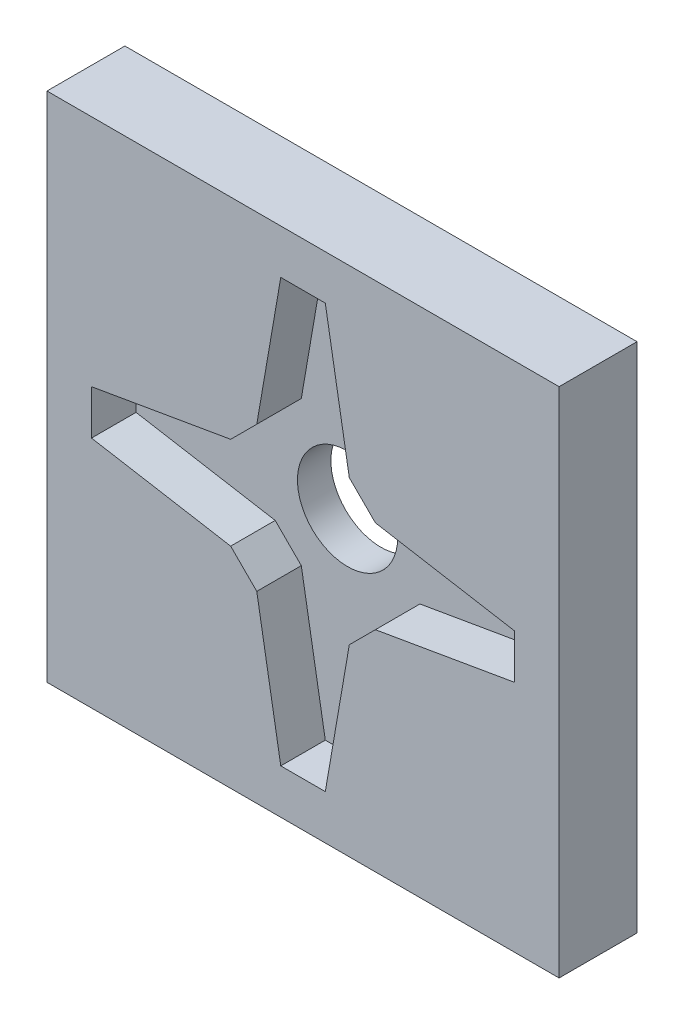
ISO-10303-21;
HEADER;
FILE_DESCRIPTION(('STEP AP214'),'2;1');
FILE_NAME('part.step','',(''),(''),'','','');
FILE_SCHEMA(('AUTOMOTIVE_DESIGN { 1 0 10303 214 1 1 1 1 }'));
ENDSEC;
DATA;
#1=APPLICATION_CONTEXT('core data for automotive mechanical design processes');
#2=APPLICATION_PROTOCOL_DEFINITION('international standard','automotive_design',2000,#1);
#3=PRODUCT_CONTEXT('',#1,'mechanical');
#4=PRODUCT('Part','Part','',(#3));
#5=PRODUCT_RELATED_PRODUCT_CATEGORY('part','',(#4));
#6=PRODUCT_DEFINITION_FORMATION('','',#4);
#7=PRODUCT_DEFINITION_CONTEXT('part definition',#1,'design');
#8=PRODUCT_DEFINITION('design','',#6,#7);
#9=PRODUCT_DEFINITION_SHAPE('','',#8);
#10=(LENGTH_UNIT() NAMED_UNIT(*) SI_UNIT(.MILLI.,.METRE.));
#11=(NAMED_UNIT(*) PLANE_ANGLE_UNIT() SI_UNIT($,.RADIAN.));
#12=(NAMED_UNIT(*) SI_UNIT($,.STERADIAN.) SOLID_ANGLE_UNIT());
#13=UNCERTAINTY_MEASURE_WITH_UNIT(LENGTH_MEASURE(1.E-05),#10,'distance_accuracy_value','');
#14=(GEOMETRIC_REPRESENTATION_CONTEXT(3) GLOBAL_UNCERTAINTY_ASSIGNED_CONTEXT((#13)) GLOBAL_UNIT_ASSIGNED_CONTEXT((#10,
#11,#12)) REPRESENTATION_CONTEXT('',''));
#15=CARTESIAN_POINT('',(0.,0.,0.));
#16=DIRECTION('',(0.,0.,1.));
#17=DIRECTION('',(1.,0.,0.));
#18=AXIS2_PLACEMENT_3D('',#15,#16,#17);
#19=CARTESIAN_POINT('',(0.,0.,7.));
#20=DIRECTION('',(0.,0.,1.));
#21=DIRECTION('',(1.,0.,0.));
#22=AXIS2_PLACEMENT_3D('',#19,#20,#21);
#23=PLANE('',#22);
#24=DIRECTION('',(-0.707106781186547,0.707106781186548,0.));
#25=VECTOR('',#24,1.);
#26=CARTESIAN_POINT('',(4.1551724137931,6.5,7.));
#27=LINE('',#26,#25);
#28=CARTESIAN_POINT('',(6.5,4.1551724137931,7.));
#29=VERTEX_POINT('',#28);
#30=CARTESIAN_POINT('',(4.1551724137931,6.5,7.));
#31=VERTEX_POINT('',#30);
#32=EDGE_CURVE('E185',#29,#31,#27,.T.);
#33=ORIENTED_EDGE('',*,*,#32,.F.);
#34=DIRECTION('',(-0.985460115744348,0.169906916507646,0.));
#35=VECTOR('',#34,1.);
#36=CARTESIAN_POINT('',(4.5,4.5,7.));
#37=LINE('',#36,#35);
#38=CARTESIAN_POINT('',(19.,2.,7.));
#39=VERTEX_POINT('',#38);
#40=EDGE_CURVE('E252',#39,#29,#37,.T.);
#41=ORIENTED_EDGE('',*,*,#40,.F.);
#42=DIRECTION('',(0.,1.,0.));
#43=VECTOR('',#42,1.);
#44=CARTESIAN_POINT('',(19.,2.,7.));
#45=LINE('',#44,#43);
#46=CARTESIAN_POINT('',(19.,-2.,7.));
#47=VERTEX_POINT('',#46);
#48=EDGE_CURVE('E248',#47,#39,#45,.T.);
#49=ORIENTED_EDGE('',*,*,#48,.F.);
#50=DIRECTION('',(0.985460115744348,0.169906916507646,0.));
#51=VECTOR('',#50,1.);
#52=CARTESIAN_POINT('',(4.5,-4.5,7.));
#53=LINE('',#52,#51);
#54=CARTESIAN_POINT('',(6.5,-4.1551724137931,7.));
#55=VERTEX_POINT('',#54);
#56=EDGE_CURVE('E245',#55,#47,#53,.T.);
#57=ORIENTED_EDGE('',*,*,#56,.F.);
#58=DIRECTION('',(0.707106781186547,0.707106781186548,0.));
#59=VECTOR('',#58,1.);
#60=CARTESIAN_POINT('',(4.1551724137931,-6.5,7.));
#61=LINE('',#60,#59);
#62=CARTESIAN_POINT('',(4.1551724137931,-6.5,7.));
#63=VERTEX_POINT('',#62);
#64=EDGE_CURVE('E553',#63,#55,#61,.T.);
#65=ORIENTED_EDGE('',*,*,#64,.F.);
#66=DIRECTION('',(0.169906916507646,0.985460115744348,0.));
#67=VECTOR('',#66,1.);
#68=CARTESIAN_POINT('',(2.,-19.,7.));
#69=LINE('',#68,#67);
#70=CARTESIAN_POINT('',(2.,-19.,7.));
#71=VERTEX_POINT('',#70);
#72=EDGE_CURVE('E241',#71,#63,#69,.T.);
#73=ORIENTED_EDGE('',*,*,#72,.F.);
#74=DIRECTION('',(1.,0.,0.));
#75=VECTOR('',#74,1.);
#76=CARTESIAN_POINT('',(-2.,-19.,7.));
#77=LINE('',#76,#75);
#78=CARTESIAN_POINT('',(-2.,-19.,7.));
#79=VERTEX_POINT('',#78);
#80=EDGE_CURVE('E238',#79,#71,#77,.T.);
#81=ORIENTED_EDGE('',*,*,#80,.F.);
#82=DIRECTION('',(0.169906916507646,-0.985460115744348,0.));
#83=VECTOR('',#82,1.);
#84=CARTESIAN_POINT('',(-2.,-19.,7.));
#85=LINE('',#84,#83);
#86=CARTESIAN_POINT('',(-4.1551724137931,-6.5,7.));
#87=VERTEX_POINT('',#86);
#88=EDGE_CURVE('E235',#87,#79,#85,.T.);
#89=ORIENTED_EDGE('',*,*,#88,.F.);
#90=DIRECTION('',(0.707106781186547,-0.707106781186548,0.));
#91=VECTOR('',#90,1.);
#92=CARTESIAN_POINT('',(-4.1551724137931,-6.5,7.));
#93=LINE('',#92,#91);
#94=CARTESIAN_POINT('',(-6.5,-4.1551724137931,7.));
#95=VERTEX_POINT('',#94);
#96=EDGE_CURVE('E550',#95,#87,#93,.T.);
#97=ORIENTED_EDGE('',*,*,#96,.F.);
#98=DIRECTION('',(0.985460115744348,-0.169906916507646,0.));
#99=VECTOR('',#98,1.);
#100=CARTESIAN_POINT('',(-4.5,-4.5,7.));
#101=LINE('',#100,#99);
#102=CARTESIAN_POINT('',(-19.,-2.,7.));
#103=VERTEX_POINT('',#102);
#104=EDGE_CURVE('E231',#103,#95,#101,.T.);
#105=ORIENTED_EDGE('',*,*,#104,.F.);
#106=DIRECTION('',(0.,-1.,0.));
#107=VECTOR('',#106,1.);
#108=CARTESIAN_POINT('',(-19.,2.,7.));
#109=LINE('',#108,#107);
#110=CARTESIAN_POINT('',(-19.,2.,7.));
#111=VERTEX_POINT('',#110);
#112=EDGE_CURVE('E228',#111,#103,#109,.T.);
#113=ORIENTED_EDGE('',*,*,#112,.F.);
#114=DIRECTION('',(-0.985460115744348,-0.169906916507646,0.));
#115=VECTOR('',#114,1.);
#116=CARTESIAN_POINT('',(-4.5,4.5,7.));
#117=LINE('',#116,#115);
#118=CARTESIAN_POINT('',(-6.5,4.1551724137931,7.));
#119=VERTEX_POINT('',#118);
#120=EDGE_CURVE('E225',#119,#111,#117,.T.);
#121=ORIENTED_EDGE('',*,*,#120,.F.);
#122=DIRECTION('',(-0.707106781186547,-0.707106781186548,0.));
#123=VECTOR('',#122,1.);
#124=CARTESIAN_POINT('',(-4.1551724137931,6.5,7.));
#125=LINE('',#124,#123);
#126=CARTESIAN_POINT('',(-4.1551724137931,6.5,7.));
#127=VERTEX_POINT('',#126);
#128=EDGE_CURVE('E547',#127,#119,#125,.T.);
#129=ORIENTED_EDGE('',*,*,#128,.F.);
#130=DIRECTION('',(-0.169906916507646,-0.985460115744348,0.));
#131=VECTOR('',#130,1.);
#132=CARTESIAN_POINT('',(-2.,19.,7.));
#133=LINE('',#132,#131);
#134=CARTESIAN_POINT('',(-2.,19.,7.));
#135=VERTEX_POINT('',#134);
#136=EDGE_CURVE('E194',#135,#127,#133,.T.);
#137=ORIENTED_EDGE('',*,*,#136,.F.);
#138=DIRECTION('',(-1.,0.,0.));
#139=VECTOR('',#138,1.);
#140=CARTESIAN_POINT('',(-2.,19.,7.));
#141=LINE('',#140,#139);
#142=CARTESIAN_POINT('',(2.,19.,7.));
#143=VERTEX_POINT('',#142);
#144=EDGE_CURVE('E220',#143,#135,#141,.T.);
#145=ORIENTED_EDGE('',*,*,#144,.F.);
#146=DIRECTION('',(-0.169906916507646,0.985460115744348,0.));
#147=VECTOR('',#146,1.);
#148=CARTESIAN_POINT('',(2.,19.,7.));
#149=LINE('',#148,#147);
#150=EDGE_CURVE('E217',#31,#143,#149,.T.);
#151=ORIENTED_EDGE('',*,*,#150,.F.);
#152=EDGE_LOOP('',(#33,#41,#49,#57,#65,#73,#81,#89,#97,#105,#113,#121,#129,#137,#145,#151));
#153=FACE_BOUND('',#152,.T.);
#154=DIRECTION('',(0.,-1.,0.));
#155=VECTOR('',#154,1.);
#156=CARTESIAN_POINT('',(-23.,-23.,7.));
#157=LINE('',#156,#155);
#158=CARTESIAN_POINT('',(-23.,23.,7.));
#159=VERTEX_POINT('',#158);
#160=CARTESIAN_POINT('',(-23.,-23.,7.));
#161=VERTEX_POINT('',#160);
#162=EDGE_CURVE('E288',#159,#161,#157,.T.);
#163=ORIENTED_EDGE('',*,*,#162,.T.);
#164=DIRECTION('',(1.,0.,0.));
#165=VECTOR('',#164,1.);
#166=CARTESIAN_POINT('',(23.,-23.,7.));
#167=LINE('',#166,#165);
#168=CARTESIAN_POINT('',(23.,-23.,7.));
#169=VERTEX_POINT('',#168);
#170=EDGE_CURVE('E292',#161,#169,#167,.T.);
#171=ORIENTED_EDGE('',*,*,#170,.T.);
#172=DIRECTION('',(0.,1.,0.));
#173=VECTOR('',#172,1.);
#174=CARTESIAN_POINT('',(23.,-23.,7.));
#175=LINE('',#174,#173);
#176=CARTESIAN_POINT('',(23.,23.,7.));
#177=VERTEX_POINT('',#176);
#178=EDGE_CURVE('E296',#169,#177,#175,.T.);
#179=ORIENTED_EDGE('',*,*,#178,.T.);
#180=DIRECTION('',(-1.,0.,0.));
#181=VECTOR('',#180,1.);
#182=CARTESIAN_POINT('',(23.,23.,7.));
#183=LINE('',#182,#181);
#184=EDGE_CURVE('E299',#177,#159,#183,.T.);
#185=ORIENTED_EDGE('',*,*,#184,.T.);
#186=EDGE_LOOP('',(#163,#171,#179,#185));
#187=FACE_BOUND('',#186,.T.);
#188=ADVANCED_FACE('F39',(#153,#187),#23,.T.);
#189=CARTESIAN_POINT('',(0.,0.,0.));
#190=DIRECTION('',(0.,0.,1.));
#191=DIRECTION('',(1.,0.,0.));
#192=AXIS2_PLACEMENT_3D('',#189,#190,#191);
#193=PLANE('',#192);
#194=CARTESIAN_POINT('',(0.,0.,0.));
#195=DIRECTION('',(0.,0.,1.));
#196=DIRECTION('',(1.,0.,0.));
#197=AXIS2_PLACEMENT_3D('',#194,#195,#196);
#198=CIRCLE('',#197,4.5);
#199=CARTESIAN_POINT('',(4.5,0.,0.));
#200=VERTEX_POINT('',#199);
#201=EDGE_CURVE('E564',#200,#200,#198,.T.);
#202=ORIENTED_EDGE('',*,*,#201,.T.);
#203=EDGE_LOOP('',(#202));
#204=FACE_BOUND('',#203,.T.);
#205=DIRECTION('',(0.,-1.,0.));
#206=VECTOR('',#205,1.);
#207=CARTESIAN_POINT('',(-23.,-23.,0.));
#208=LINE('',#207,#206);
#209=CARTESIAN_POINT('',(-23.,23.,0.));
#210=VERTEX_POINT('',#209);
#211=CARTESIAN_POINT('',(-23.,-23.,0.));
#212=VERTEX_POINT('',#211);
#213=EDGE_CURVE('E287',#210,#212,#208,.T.);
#214=ORIENTED_EDGE('',*,*,#213,.F.);
#215=DIRECTION('',(-1.,0.,0.));
#216=VECTOR('',#215,1.);
#217=CARTESIAN_POINT('',(23.,23.,0.));
#218=LINE('',#217,#216);
#219=CARTESIAN_POINT('',(23.,23.,0.));
#220=VERTEX_POINT('',#219);
#221=EDGE_CURVE('E293',#220,#210,#218,.T.);
#222=ORIENTED_EDGE('',*,*,#221,.F.);
#223=DIRECTION('',(0.,1.,0.));
#224=VECTOR('',#223,1.);
#225=CARTESIAN_POINT('',(23.,-23.,0.));
#226=LINE('',#225,#224);
#227=CARTESIAN_POINT('',(23.,-23.,0.));
#228=VERTEX_POINT('',#227);
#229=EDGE_CURVE('E310',#228,#220,#226,.T.);
#230=ORIENTED_EDGE('',*,*,#229,.F.);
#231=DIRECTION('',(1.,0.,0.));
#232=VECTOR('',#231,1.);
#233=CARTESIAN_POINT('',(23.,-23.,0.));
#234=LINE('',#233,#232);
#235=EDGE_CURVE('E306',#212,#228,#234,.T.);
#236=ORIENTED_EDGE('',*,*,#235,.F.);
#237=EDGE_LOOP('',(#214,#222,#230,#236));
#238=FACE_BOUND('',#237,.T.);
#239=ADVANCED_FACE('F335',(#204,#238),#193,.F.);
#240=CARTESIAN_POINT('',(-23.,-23.,7.));
#241=DIRECTION('',(1.,0.,0.));
#242=DIRECTION('',(0.,0.,-1.));
#243=AXIS2_PLACEMENT_3D('',#240,#241,#242);
#244=PLANE('',#243);
#245=DIRECTION('',(0.,0.,-1.));
#246=VECTOR('',#245,1.);
#247=CARTESIAN_POINT('',(-23.,23.,7.));
#248=LINE('',#247,#246);
#249=EDGE_CURVE('E302',#159,#210,#248,.T.);
#250=ORIENTED_EDGE('',*,*,#249,.T.);
#251=ORIENTED_EDGE('',*,*,#213,.T.);
#252=DIRECTION('',(0.,0.,-1.));
#253=VECTOR('',#252,1.);
#254=CARTESIAN_POINT('',(-23.,-23.,7.));
#255=LINE('',#254,#253);
#256=EDGE_CURVE('E48',#161,#212,#255,.T.);
#257=ORIENTED_EDGE('',*,*,#256,.F.);
#258=ORIENTED_EDGE('',*,*,#162,.F.);
#259=EDGE_LOOP('',(#250,#251,#257,#258));
#260=FACE_BOUND('',#259,.T.);
#261=ADVANCED_FACE('F41',(#260),#244,.F.);
#262=CARTESIAN_POINT('',(23.,-23.,7.));
#263=DIRECTION('',(0.,1.,0.));
#264=DIRECTION('',(0.,0.,1.));
#265=AXIS2_PLACEMENT_3D('',#262,#263,#264);
#266=PLANE('',#265);
#267=ORIENTED_EDGE('',*,*,#256,.T.);
#268=ORIENTED_EDGE('',*,*,#235,.T.);
#269=DIRECTION('',(0.,0.,-1.));
#270=VECTOR('',#269,1.);
#271=CARTESIAN_POINT('',(23.,-23.,7.));
#272=LINE('',#271,#270);
#273=EDGE_CURVE('E322',#169,#228,#272,.T.);
#274=ORIENTED_EDGE('',*,*,#273,.F.);
#275=ORIENTED_EDGE('',*,*,#170,.F.);
#276=EDGE_LOOP('',(#267,#268,#274,#275));
#277=FACE_BOUND('',#276,.T.);
#278=ADVANCED_FACE('F328',(#277),#266,.F.);
#279=CARTESIAN_POINT('',(23.,-23.,7.));
#280=DIRECTION('',(-1.,0.,0.));
#281=DIRECTION('',(0.,0.,1.));
#282=AXIS2_PLACEMENT_3D('',#279,#280,#281);
#283=PLANE('',#282);
#284=ORIENTED_EDGE('',*,*,#273,.T.);
#285=ORIENTED_EDGE('',*,*,#229,.T.);
#286=DIRECTION('',(0.,0.,-1.));
#287=VECTOR('',#286,1.);
#288=CARTESIAN_POINT('',(23.,23.,7.));
#289=LINE('',#288,#287);
#290=EDGE_CURVE('E319',#177,#220,#289,.T.);
#291=ORIENTED_EDGE('',*,*,#290,.F.);
#292=ORIENTED_EDGE('',*,*,#178,.F.);
#293=EDGE_LOOP('',(#284,#285,#291,#292));
#294=FACE_BOUND('',#293,.T.);
#295=ADVANCED_FACE('F344',(#294),#283,.F.);
#296=CARTESIAN_POINT('',(23.,23.,7.));
#297=DIRECTION('',(0.,-1.,0.));
#298=DIRECTION('',(0.,0.,-1.));
#299=AXIS2_PLACEMENT_3D('',#296,#297,#298);
#300=PLANE('',#299);
#301=ORIENTED_EDGE('',*,*,#290,.T.);
#302=ORIENTED_EDGE('',*,*,#221,.T.);
#303=ORIENTED_EDGE('',*,*,#249,.F.);
#304=ORIENTED_EDGE('',*,*,#184,.F.);
#305=EDGE_LOOP('',(#301,#302,#303,#304));
#306=FACE_BOUND('',#305,.T.);
#307=ADVANCED_FACE('F340',(#306),#300,.F.);
#308=CARTESIAN_POINT('',(2.,19.,7.));
#309=DIRECTION('',(-0.985460115744348,-0.169906916507646,0.));
#310=DIRECTION('',(0.169906916507646,-0.985460115744348,0.));
#311=AXIS2_PLACEMENT_3D('',#308,#309,#310);
#312=PLANE('',#311);
#313=DIRECTION('',(0.,0.,1.));
#314=VECTOR('',#313,1.);
#315=CARTESIAN_POINT('',(4.1551724137931,6.5,3.));
#316=LINE('',#315,#314);
#317=CARTESIAN_POINT('',(4.1551724137931,6.5,3.));
#318=VERTEX_POINT('',#317);
#319=EDGE_CURVE('E544',#318,#31,#316,.T.);
#320=ORIENTED_EDGE('',*,*,#319,.T.);
#321=ORIENTED_EDGE('',*,*,#150,.T.);
#322=DIRECTION('',(0.,0.,-1.));
#323=VECTOR('',#322,1.);
#324=CARTESIAN_POINT('',(2.,19.,7.));
#325=LINE('',#324,#323);
#326=CARTESIAN_POINT('',(2.,19.,3.));
#327=VERTEX_POINT('',#326);
#328=EDGE_CURVE('E283',#143,#327,#325,.T.);
#329=ORIENTED_EDGE('',*,*,#328,.T.);
#330=DIRECTION('',(-0.169906916507646,0.985460115744348,0.));
#331=VECTOR('',#330,1.);
#332=CARTESIAN_POINT('',(2.,19.,3.));
#333=LINE('',#332,#331);
#334=EDGE_CURVE('E209',#318,#327,#333,.T.);
#335=ORIENTED_EDGE('',*,*,#334,.F.);
#336=EDGE_LOOP('',(#320,#321,#329,#335));
#337=FACE_BOUND('',#336,.T.);
#338=ADVANCED_FACE('F356',(#337),#312,.T.);
#339=CARTESIAN_POINT('',(-2.,19.,7.));
#340=DIRECTION('',(0.,-1.,0.));
#341=DIRECTION('',(0.,0.,-1.));
#342=AXIS2_PLACEMENT_3D('',#339,#340,#341);
#343=PLANE('',#342);
#344=DIRECTION('',(-1.,0.,0.));
#345=VECTOR('',#344,1.);
#346=CARTESIAN_POINT('',(-2.,19.,3.));
#347=LINE('',#346,#345);
#348=CARTESIAN_POINT('',(-2.,19.,3.));
#349=VERTEX_POINT('',#348);
#350=EDGE_CURVE('E203',#327,#349,#347,.T.);
#351=ORIENTED_EDGE('',*,*,#350,.F.);
#352=ORIENTED_EDGE('',*,*,#328,.F.);
#353=ORIENTED_EDGE('',*,*,#144,.T.);
#354=DIRECTION('',(0.,0.,-1.));
#355=VECTOR('',#354,1.);
#356=CARTESIAN_POINT('',(-2.,19.,7.));
#357=LINE('',#356,#355);
#358=EDGE_CURVE('E280',#135,#349,#357,.T.);
#359=ORIENTED_EDGE('',*,*,#358,.T.);
#360=EDGE_LOOP('',(#351,#352,#353,#359));
#361=FACE_BOUND('',#360,.T.);
#362=ADVANCED_FACE('F408',(#361),#343,.T.);
#363=CARTESIAN_POINT('',(-2.,19.,7.));
#364=DIRECTION('',(0.985460115744348,-0.169906916507646,0.));
#365=DIRECTION('',(0.169906916507646,0.985460115744348,0.));
#366=AXIS2_PLACEMENT_3D('',#363,#364,#365);
#367=PLANE('',#366);
#368=DIRECTION('',(0.,0.,1.));
#369=VECTOR('',#368,1.);
#370=CARTESIAN_POINT('',(-4.1551724137931,6.5,3.));
#371=LINE('',#370,#369);
#372=CARTESIAN_POINT('',(-4.1551724137931,6.5,3.));
#373=VERTEX_POINT('',#372);
#374=EDGE_CURVE('E178',#373,#127,#371,.T.);
#375=ORIENTED_EDGE('',*,*,#374,.F.);
#376=DIRECTION('',(-0.169906916507646,-0.985460115744348,0.));
#377=VECTOR('',#376,1.);
#378=CARTESIAN_POINT('',(-2.,19.,3.));
#379=LINE('',#378,#377);
#380=EDGE_CURVE('E191',#349,#373,#379,.T.);
#381=ORIENTED_EDGE('',*,*,#380,.F.);
#382=ORIENTED_EDGE('',*,*,#358,.F.);
#383=ORIENTED_EDGE('',*,*,#136,.T.);
#384=EDGE_LOOP('',(#375,#381,#382,#383));
#385=FACE_BOUND('',#384,.T.);
#386=ADVANCED_FACE('F189',(#385),#367,.T.);
#387=CARTESIAN_POINT('',(-4.5,4.5,7.));
#388=DIRECTION('',(0.169906916507646,-0.985460115744348,0.));
#389=DIRECTION('',(0.985460115744348,0.169906916507646,0.));
#390=AXIS2_PLACEMENT_3D('',#387,#388,#389);
#391=PLANE('',#390);
#392=DIRECTION('',(0.,0.,1.));
#393=VECTOR('',#392,1.);
#394=CARTESIAN_POINT('',(-6.5,4.1551724137931,3.));
#395=LINE('',#394,#393);
#396=CARTESIAN_POINT('',(-6.5,4.1551724137931,3.));
#397=VERTEX_POINT('',#396);
#398=EDGE_CURVE('E181',#397,#119,#395,.T.);
#399=ORIENTED_EDGE('',*,*,#398,.T.);
#400=ORIENTED_EDGE('',*,*,#120,.T.);
#401=DIRECTION('',(0.,0.,-1.));
#402=VECTOR('',#401,1.);
#403=CARTESIAN_POINT('',(-19.,2.,7.));
#404=LINE('',#403,#402);
#405=CARTESIAN_POINT('',(-19.,2.,3.));
#406=VERTEX_POINT('',#405);
#407=EDGE_CURVE('E276',#111,#406,#404,.T.);
#408=ORIENTED_EDGE('',*,*,#407,.T.);
#409=DIRECTION('',(-0.985460115744348,-0.169906916507646,0.));
#410=VECTOR('',#409,1.);
#411=CARTESIAN_POINT('',(-4.5,4.5,3.));
#412=LINE('',#411,#410);
#413=EDGE_CURVE('E205',#397,#406,#412,.T.);
#414=ORIENTED_EDGE('',*,*,#413,.F.);
#415=EDGE_LOOP('',(#399,#400,#408,#414));
#416=FACE_BOUND('',#415,.T.);
#417=ADVANCED_FACE('F420',(#416),#391,.T.);
#418=CARTESIAN_POINT('',(-19.,2.,7.));
#419=DIRECTION('',(1.,0.,0.));
#420=DIRECTION('',(0.,0.,-1.));
#421=AXIS2_PLACEMENT_3D('',#418,#419,#420);
#422=PLANE('',#421);
#423=DIRECTION('',(0.,-1.,0.));
#424=VECTOR('',#423,1.);
#425=CARTESIAN_POINT('',(-19.,2.,3.));
#426=LINE('',#425,#424);
#427=CARTESIAN_POINT('',(-19.,-2.,3.));
#428=VERTEX_POINT('',#427);
#429=EDGE_CURVE('E211',#406,#428,#426,.T.);
#430=ORIENTED_EDGE('',*,*,#429,.F.);
#431=ORIENTED_EDGE('',*,*,#407,.F.);
#432=ORIENTED_EDGE('',*,*,#112,.T.);
#433=DIRECTION('',(0.,0.,-1.));
#434=VECTOR('',#433,1.);
#435=CARTESIAN_POINT('',(-19.,-2.,7.));
#436=LINE('',#435,#434);
#437=EDGE_CURVE('E272',#103,#428,#436,.T.);
#438=ORIENTED_EDGE('',*,*,#437,.T.);
#439=EDGE_LOOP('',(#430,#431,#432,#438));
#440=FACE_BOUND('',#439,.T.);
#441=ADVANCED_FACE('F429',(#440),#422,.T.);
#442=CARTESIAN_POINT('',(-4.5,-4.5,7.));
#443=DIRECTION('',(0.169906916507646,0.985460115744348,0.));
#444=DIRECTION('',(-0.985460115744348,0.169906916507646,0.));
#445=AXIS2_PLACEMENT_3D('',#442,#443,#444);
#446=PLANE('',#445);
#447=DIRECTION('',(0.,0.,1.));
#448=VECTOR('',#447,1.);
#449=CARTESIAN_POINT('',(-6.5,-4.1551724137931,3.));
#450=LINE('',#449,#448);
#451=CARTESIAN_POINT('',(-6.5,-4.1551724137931,3.));
#452=VERTEX_POINT('',#451);
#453=EDGE_CURVE('E579',#452,#95,#450,.T.);
#454=ORIENTED_EDGE('',*,*,#453,.F.);
#455=DIRECTION('',(0.985460115744348,-0.169906916507646,0.));
#456=VECTOR('',#455,1.);
#457=CARTESIAN_POINT('',(-4.5,-4.5,3.));
#458=LINE('',#457,#456);
#459=EDGE_CURVE('E608',#428,#452,#458,.T.);
#460=ORIENTED_EDGE('',*,*,#459,.F.);
#461=ORIENTED_EDGE('',*,*,#437,.F.);
#462=ORIENTED_EDGE('',*,*,#104,.T.);
#463=EDGE_LOOP('',(#454,#460,#461,#462));
#464=FACE_BOUND('',#463,.T.);
#465=ADVANCED_FACE('F437',(#464),#446,.T.);
#466=CARTESIAN_POINT('',(-2.,-19.,7.));
#467=DIRECTION('',(0.985460115744348,0.169906916507646,0.));
#468=DIRECTION('',(-0.169906916507646,0.985460115744348,0.));
#469=AXIS2_PLACEMENT_3D('',#466,#467,#468);
#470=PLANE('',#469);
#471=DIRECTION('',(0.,0.,1.));
#472=VECTOR('',#471,1.);
#473=CARTESIAN_POINT('',(-4.1551724137931,-6.5,3.));
#474=LINE('',#473,#472);
#475=CARTESIAN_POINT('',(-4.1551724137931,-6.50000000000001,3.));
#476=VERTEX_POINT('',#475);
#477=EDGE_CURVE('E575',#476,#87,#474,.T.);
#478=ORIENTED_EDGE('',*,*,#477,.T.);
#479=ORIENTED_EDGE('',*,*,#88,.T.);
#480=DIRECTION('',(0.,0.,-1.));
#481=VECTOR('',#480,1.);
#482=CARTESIAN_POINT('',(-2.,-19.,7.));
#483=LINE('',#482,#481);
#484=CARTESIAN_POINT('',(-2.,-19.,3.));
#485=VERTEX_POINT('',#484);
#486=EDGE_CURVE('E268',#79,#485,#483,.T.);
#487=ORIENTED_EDGE('',*,*,#486,.T.);
#488=DIRECTION('',(0.169906916507646,-0.985460115744348,0.));
#489=VECTOR('',#488,1.);
#490=CARTESIAN_POINT('',(-2.,-19.,3.));
#491=LINE('',#490,#489);
#492=EDGE_CURVE('E605',#476,#485,#491,.T.);
#493=ORIENTED_EDGE('',*,*,#492,.F.);
#494=EDGE_LOOP('',(#478,#479,#487,#493));
#495=FACE_BOUND('',#494,.T.);
#496=ADVANCED_FACE('F442',(#495),#470,.T.);
#497=CARTESIAN_POINT('',(-2.,-19.,7.));
#498=DIRECTION('',(0.,1.,0.));
#499=DIRECTION('',(0.,0.,1.));
#500=AXIS2_PLACEMENT_3D('',#497,#498,#499);
#501=PLANE('',#500);
#502=DIRECTION('',(1.,0.,0.));
#503=VECTOR('',#502,1.);
#504=CARTESIAN_POINT('',(-2.,-19.,3.));
#505=LINE('',#504,#503);
#506=CARTESIAN_POINT('',(2.,-19.,3.));
#507=VERTEX_POINT('',#506);
#508=EDGE_CURVE('E601',#485,#507,#505,.T.);
#509=ORIENTED_EDGE('',*,*,#508,.F.);
#510=ORIENTED_EDGE('',*,*,#486,.F.);
#511=ORIENTED_EDGE('',*,*,#80,.T.);
#512=DIRECTION('',(0.,0.,-1.));
#513=VECTOR('',#512,1.);
#514=CARTESIAN_POINT('',(2.,-19.,7.));
#515=LINE('',#514,#513);
#516=EDGE_CURVE('E264',#71,#507,#515,.T.);
#517=ORIENTED_EDGE('',*,*,#516,.T.);
#518=EDGE_LOOP('',(#509,#510,#511,#517));
#519=FACE_BOUND('',#518,.T.);
#520=ADVANCED_FACE('F452',(#519),#501,.T.);
#521=CARTESIAN_POINT('',(2.,-19.,7.));
#522=DIRECTION('',(-0.985460115744348,0.169906916507646,0.));
#523=DIRECTION('',(-0.169906916507646,-0.985460115744348,0.));
#524=AXIS2_PLACEMENT_3D('',#521,#522,#523);
#525=PLANE('',#524);
#526=DIRECTION('',(0.,0.,1.));
#527=VECTOR('',#526,1.);
#528=CARTESIAN_POINT('',(4.1551724137931,-6.5,3.));
#529=LINE('',#528,#527);
#530=CARTESIAN_POINT('',(4.1551724137931,-6.5,3.));
#531=VERTEX_POINT('',#530);
#532=EDGE_CURVE('E572',#531,#63,#529,.T.);
#533=ORIENTED_EDGE('',*,*,#532,.F.);
#534=DIRECTION('',(0.169906916507646,0.985460115744348,0.));
#535=VECTOR('',#534,1.);
#536=CARTESIAN_POINT('',(2.,-19.,3.));
#537=LINE('',#536,#535);
#538=EDGE_CURVE('E598',#507,#531,#537,.T.);
#539=ORIENTED_EDGE('',*,*,#538,.F.);
#540=ORIENTED_EDGE('',*,*,#516,.F.);
#541=ORIENTED_EDGE('',*,*,#72,.T.);
#542=EDGE_LOOP('',(#533,#539,#540,#541));
#543=FACE_BOUND('',#542,.T.);
#544=ADVANCED_FACE('F460',(#543),#525,.T.);
#545=CARTESIAN_POINT('',(4.5,-4.5,7.));
#546=DIRECTION('',(-0.169906916507646,0.985460115744348,0.));
#547=DIRECTION('',(-0.985460115744348,-0.169906916507646,0.));
#548=AXIS2_PLACEMENT_3D('',#545,#546,#547);
#549=PLANE('',#548);
#550=DIRECTION('',(0.,0.,1.));
#551=VECTOR('',#550,1.);
#552=CARTESIAN_POINT('',(6.5,-4.1551724137931,3.));
#553=LINE('',#552,#551);
#554=CARTESIAN_POINT('',(6.5,-4.1551724137931,3.));
#555=VERTEX_POINT('',#554);
#556=EDGE_CURVE('E568',#555,#55,#553,.T.);
#557=ORIENTED_EDGE('',*,*,#556,.T.);
#558=ORIENTED_EDGE('',*,*,#56,.T.);
#559=DIRECTION('',(0.,0.,-1.));
#560=VECTOR('',#559,1.);
#561=CARTESIAN_POINT('',(19.,-2.,7.));
#562=LINE('',#561,#560);
#563=CARTESIAN_POINT('',(19.,-2.,3.));
#564=VERTEX_POINT('',#563);
#565=EDGE_CURVE('E260',#47,#564,#562,.T.);
#566=ORIENTED_EDGE('',*,*,#565,.T.);
#567=DIRECTION('',(0.985460115744348,0.169906916507646,0.));
#568=VECTOR('',#567,1.);
#569=CARTESIAN_POINT('',(4.5,-4.5,3.));
#570=LINE('',#569,#568);
#571=EDGE_CURVE('E595',#555,#564,#570,.T.);
#572=ORIENTED_EDGE('',*,*,#571,.F.);
#573=EDGE_LOOP('',(#557,#558,#566,#572));
#574=FACE_BOUND('',#573,.T.);
#575=ADVANCED_FACE('F465',(#574),#549,.T.);
#576=CARTESIAN_POINT('',(19.,2.,7.));
#577=DIRECTION('',(-1.,0.,0.));
#578=DIRECTION('',(0.,0.,1.));
#579=AXIS2_PLACEMENT_3D('',#576,#577,#578);
#580=PLANE('',#579);
#581=DIRECTION('',(0.,1.,0.));
#582=VECTOR('',#581,1.);
#583=CARTESIAN_POINT('',(19.,2.,3.));
#584=LINE('',#583,#582);
#585=CARTESIAN_POINT('',(19.,2.,3.));
#586=VERTEX_POINT('',#585);
#587=EDGE_CURVE('E588',#564,#586,#584,.T.);
#588=ORIENTED_EDGE('',*,*,#587,.F.);
#589=ORIENTED_EDGE('',*,*,#565,.F.);
#590=ORIENTED_EDGE('',*,*,#48,.T.);
#591=DIRECTION('',(0.,0.,-1.));
#592=VECTOR('',#591,1.);
#593=CARTESIAN_POINT('',(19.,2.,7.));
#594=LINE('',#593,#592);
#595=EDGE_CURVE('E256',#39,#586,#594,.T.);
#596=ORIENTED_EDGE('',*,*,#595,.T.);
#597=EDGE_LOOP('',(#588,#589,#590,#596));
#598=FACE_BOUND('',#597,.T.);
#599=ADVANCED_FACE('F381',(#598),#580,.T.);
#600=CARTESIAN_POINT('',(4.5,4.5,7.));
#601=DIRECTION('',(-0.169906916507646,-0.985460115744348,0.));
#602=DIRECTION('',(0.985460115744348,-0.169906916507646,0.));
#603=AXIS2_PLACEMENT_3D('',#600,#601,#602);
#604=PLANE('',#603);
#605=DIRECTION('',(0.,0.,1.));
#606=VECTOR('',#605,1.);
#607=CARTESIAN_POINT('',(6.5,4.1551724137931,3.));
#608=LINE('',#607,#606);
#609=CARTESIAN_POINT('',(6.5,4.1551724137931,3.));
#610=VERTEX_POINT('',#609);
#611=EDGE_CURVE('E565',#610,#29,#608,.T.);
#612=ORIENTED_EDGE('',*,*,#611,.F.);
#613=DIRECTION('',(-0.985460115744348,0.169906916507646,0.));
#614=VECTOR('',#613,1.);
#615=CARTESIAN_POINT('',(4.5,4.5,3.));
#616=LINE('',#615,#614);
#617=EDGE_CURVE('E11',#586,#610,#616,.T.);
#618=ORIENTED_EDGE('',*,*,#617,.F.);
#619=ORIENTED_EDGE('',*,*,#595,.F.);
#620=ORIENTED_EDGE('',*,*,#40,.T.);
#621=EDGE_LOOP('',(#612,#618,#619,#620));
#622=FACE_BOUND('',#621,.T.);
#623=ADVANCED_FACE('F480',(#622),#604,.T.);
#624=CARTESIAN_POINT('',(0.,0.,3.));
#625=DIRECTION('',(0.,0.,1.));
#626=DIRECTION('',(1.,0.,0.));
#627=AXIS2_PLACEMENT_3D('',#624,#625,#626);
#628=PLANE('',#627);
#629=DIRECTION('',(-0.707106781186547,0.707106781186548,0.));
#630=VECTOR('',#629,1.);
#631=CARTESIAN_POINT('',(4.1551724137931,6.5,3.));
#632=LINE('',#631,#630);
#633=EDGE_CURVE('E196',#610,#318,#632,.T.);
#634=ORIENTED_EDGE('',*,*,#633,.T.);
#635=ORIENTED_EDGE('',*,*,#334,.T.);
#636=ORIENTED_EDGE('',*,*,#350,.T.);
#637=ORIENTED_EDGE('',*,*,#380,.T.);
#638=DIRECTION('',(-0.707106781186547,-0.707106781186548,0.));
#639=VECTOR('',#638,1.);
#640=CARTESIAN_POINT('',(-4.1551724137931,6.5,3.));
#641=LINE('',#640,#639);
#642=EDGE_CURVE('E175',#373,#397,#641,.T.);
#643=ORIENTED_EDGE('',*,*,#642,.T.);
#644=ORIENTED_EDGE('',*,*,#413,.T.);
#645=ORIENTED_EDGE('',*,*,#429,.T.);
#646=ORIENTED_EDGE('',*,*,#459,.T.);
#647=DIRECTION('',(0.707106781186547,-0.707106781186548,0.));
#648=VECTOR('',#647,1.);
#649=CARTESIAN_POINT('',(-4.1551724137931,-6.5,3.));
#650=LINE('',#649,#648);
#651=EDGE_CURVE('E62',#452,#476,#650,.T.);
#652=ORIENTED_EDGE('',*,*,#651,.T.);
#653=ORIENTED_EDGE('',*,*,#492,.T.);
#654=ORIENTED_EDGE('',*,*,#508,.T.);
#655=ORIENTED_EDGE('',*,*,#538,.T.);
#656=DIRECTION('',(0.707106781186547,0.707106781186548,0.));
#657=VECTOR('',#656,1.);
#658=CARTESIAN_POINT('',(4.1551724137931,-6.5,3.));
#659=LINE('',#658,#657);
#660=EDGE_CURVE('E55',#531,#555,#659,.T.);
#661=ORIENTED_EDGE('',*,*,#660,.T.);
#662=ORIENTED_EDGE('',*,*,#571,.T.);
#663=ORIENTED_EDGE('',*,*,#587,.T.);
#664=ORIENTED_EDGE('',*,*,#617,.T.);
#665=EDGE_LOOP('',(#634,#635,#636,#637,#643,#644,#645,#646,#652,#653,#654,#655,#661,#662,#663,#664));
#666=FACE_BOUND('',#665,.T.);
#667=CARTESIAN_POINT('',(0.,0.,3.));
#668=DIRECTION('',(0.,0.,1.));
#669=DIRECTION('',(1.,0.,0.));
#670=AXIS2_PLACEMENT_3D('',#667,#668,#669);
#671=CIRCLE('',#670,4.5);
#672=CARTESIAN_POINT('',(4.5,0.,3.));
#673=VERTEX_POINT('',#672);
#674=EDGE_CURVE('E584',#673,#673,#671,.T.);
#675=ORIENTED_EDGE('',*,*,#674,.F.);
#676=EDGE_LOOP('',(#675));
#677=FACE_BOUND('',#676,.T.);
#678=ADVANCED_FACE('F200',(#666,#677),#628,.T.);
#679=CARTESIAN_POINT('',(0.,0.,3.));
#680=DIRECTION('',(0.,0.,-1.));
#681=DIRECTION('',(-1.,0.,0.));
#682=AXIS2_PLACEMENT_3D('',#679,#680,#681);
#683=CYLINDRICAL_SURFACE('',#682,4.5);
#684=ORIENTED_EDGE('',*,*,#674,.T.);
#685=EDGE_LOOP('',(#684));
#686=FACE_BOUND('',#685,.T.);
#687=ORIENTED_EDGE('',*,*,#201,.F.);
#688=EDGE_LOOP('',(#687));
#689=FACE_BOUND('',#688,.T.);
#690=ADVANCED_FACE('F386',(#686,#689),#683,.F.);
#691=CARTESIAN_POINT('',(4.1551724137931,6.5,3.));
#692=DIRECTION('',(0.707106781186548,0.707106781186547,0.));
#693=DIRECTION('',(-0.707106781186547,0.707106781186548,0.));
#694=AXIS2_PLACEMENT_3D('',#691,#692,#693);
#695=PLANE('',#694);
#696=ORIENTED_EDGE('',*,*,#32,.T.);
#697=ORIENTED_EDGE('',*,*,#319,.F.);
#698=ORIENTED_EDGE('',*,*,#633,.F.);
#699=ORIENTED_EDGE('',*,*,#611,.T.);
#700=EDGE_LOOP('',(#696,#697,#698,#699));
#701=FACE_BOUND('',#700,.T.);
#702=ADVANCED_FACE('F390',(#701),#695,.F.);
#703=CARTESIAN_POINT('',(4.1551724137931,-6.5,3.));
#704=DIRECTION('',(0.707106781186548,-0.707106781186547,0.));
#705=DIRECTION('',(0.707106781186547,0.707106781186548,0.));
#706=AXIS2_PLACEMENT_3D('',#703,#704,#705);
#707=PLANE('',#706);
#708=ORIENTED_EDGE('',*,*,#64,.T.);
#709=ORIENTED_EDGE('',*,*,#556,.F.);
#710=ORIENTED_EDGE('',*,*,#660,.F.);
#711=ORIENTED_EDGE('',*,*,#532,.T.);
#712=EDGE_LOOP('',(#708,#709,#710,#711));
#713=FACE_BOUND('',#712,.T.);
#714=ADVANCED_FACE('F498',(#713),#707,.F.);
#715=CARTESIAN_POINT('',(-4.1551724137931,-6.5,3.));
#716=DIRECTION('',(-0.707106781186548,-0.707106781186547,0.));
#717=DIRECTION('',(0.707106781186547,-0.707106781186548,0.));
#718=AXIS2_PLACEMENT_3D('',#715,#716,#717);
#719=PLANE('',#718);
#720=ORIENTED_EDGE('',*,*,#96,.T.);
#721=ORIENTED_EDGE('',*,*,#477,.F.);
#722=ORIENTED_EDGE('',*,*,#651,.F.);
#723=ORIENTED_EDGE('',*,*,#453,.T.);
#724=EDGE_LOOP('',(#720,#721,#722,#723));
#725=FACE_BOUND('',#724,.T.);
#726=ADVANCED_FACE('F508',(#725),#719,.F.);
#727=CARTESIAN_POINT('',(-4.1551724137931,6.5,3.));
#728=DIRECTION('',(-0.707106781186548,0.707106781186547,0.));
#729=DIRECTION('',(-0.707106781186547,-0.707106781186548,0.));
#730=AXIS2_PLACEMENT_3D('',#727,#728,#729);
#731=PLANE('',#730);
#732=ORIENTED_EDGE('',*,*,#128,.T.);
#733=ORIENTED_EDGE('',*,*,#398,.F.);
#734=ORIENTED_EDGE('',*,*,#642,.F.);
#735=ORIENTED_EDGE('',*,*,#374,.T.);
#736=EDGE_LOOP('',(#732,#733,#734,#735));
#737=FACE_BOUND('',#736,.T.);
#738=ADVANCED_FACE('F177',(#737),#731,.F.);
#739=CLOSED_SHELL('',(#188,#239,#261,#278,#295,#307,#338,#362,#386,#417,#441,#465,#496,#520,
#544,#575,#599,#623,#678,#690,#702,#714,#726,#738));
#740=MANIFOLD_SOLID_BREP('B2',#739);
#741=ADVANCED_BREP_SHAPE_REPRESENTATION('',(#18,#740),#14);
#742=SHAPE_DEFINITION_REPRESENTATION(#9,#741);
ENDSEC;
END-ISO-10303-21;
